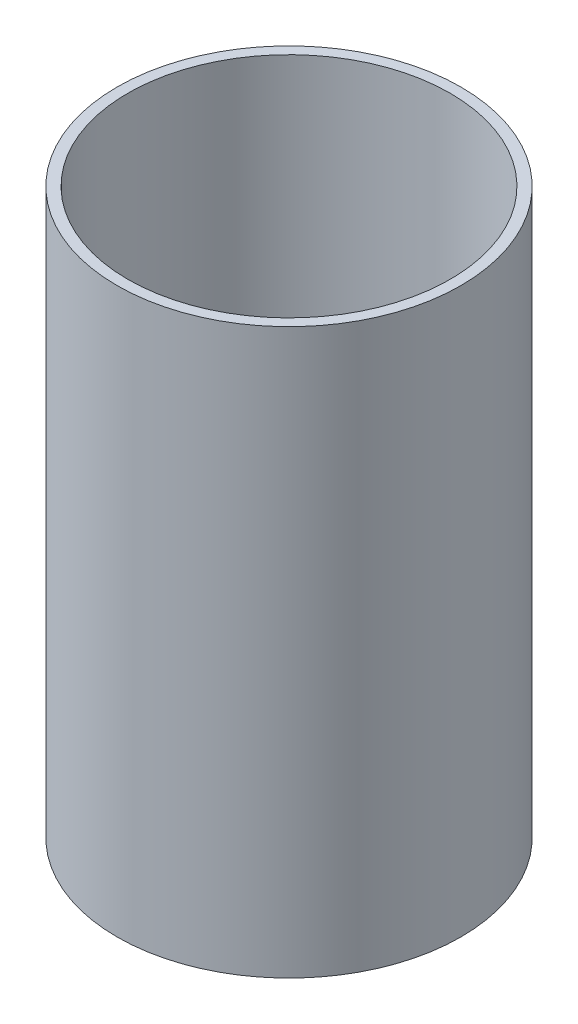
ISO-10303-21;
HEADER;
FILE_DESCRIPTION(('STEP AP214'),'2;1');
FILE_NAME('part.step','',(''),(''),'','','');
FILE_SCHEMA(('AUTOMOTIVE_DESIGN { 1 0 10303 214 1 1 1 1 }'));
ENDSEC;
DATA;
#1=APPLICATION_CONTEXT('core data for automotive mechanical design processes');
#2=APPLICATION_PROTOCOL_DEFINITION('international standard','automotive_design',2000,#1);
#3=PRODUCT_CONTEXT('',#1,'mechanical');
#4=PRODUCT('Part','Part','',(#3));
#5=PRODUCT_RELATED_PRODUCT_CATEGORY('part','',(#4));
#6=PRODUCT_DEFINITION_FORMATION('','',#4);
#7=PRODUCT_DEFINITION_CONTEXT('part definition',#1,'design');
#8=PRODUCT_DEFINITION('design','',#6,#7);
#9=PRODUCT_DEFINITION_SHAPE('','',#8);
#10=(LENGTH_UNIT() NAMED_UNIT(*) SI_UNIT(.MILLI.,.METRE.));
#11=(NAMED_UNIT(*) PLANE_ANGLE_UNIT() SI_UNIT($,.RADIAN.));
#12=(NAMED_UNIT(*) SI_UNIT($,.STERADIAN.) SOLID_ANGLE_UNIT());
#13=UNCERTAINTY_MEASURE_WITH_UNIT(LENGTH_MEASURE(1.E-05),#10,'distance_accuracy_value','');
#14=(GEOMETRIC_REPRESENTATION_CONTEXT(3) GLOBAL_UNCERTAINTY_ASSIGNED_CONTEXT((#13)) GLOBAL_UNIT_ASSIGNED_CONTEXT((#10,
#11,#12)) REPRESENTATION_CONTEXT('',''));
#15=CARTESIAN_POINT('',(0.,0.,0.));
#16=DIRECTION('',(0.,0.,1.));
#17=DIRECTION('',(1.,0.,0.));
#18=AXIS2_PLACEMENT_3D('',#15,#16,#17);
#19=CARTESIAN_POINT('',(0.,2.,0.));
#20=DIRECTION('',(0.,1.,0.));
#21=DIRECTION('',(0.,0.,1.));
#22=AXIS2_PLACEMENT_3D('',#19,#20,#21);
#23=PLANE('',#22);
#24=CARTESIAN_POINT('',(0.,2.,0.));
#25=DIRECTION('',(0.,1.,0.));
#26=DIRECTION('',(0.,0.,1.));
#27=AXIS2_PLACEMENT_3D('',#24,#25,#26);
#28=CIRCLE('',#27,0.6096);
#29=CARTESIAN_POINT('',(0.,2.,0.6096));
#30=VERTEX_POINT('',#29);
#31=EDGE_CURVE('E10',#30,#30,#28,.T.);
#32=ORIENTED_EDGE('',*,*,#31,.T.);
#33=EDGE_LOOP('',(#32));
#34=FACE_BOUND('',#33,.T.);
#35=CARTESIAN_POINT('',(0.,2.,0.));
#36=DIRECTION('',(0.,1.,0.));
#37=DIRECTION('',(0.,0.,1.));
#38=AXIS2_PLACEMENT_3D('',#35,#36,#37);
#39=CIRCLE('',#38,0.5715);
#40=CARTESIAN_POINT('',(0.,2.,0.5715));
#41=VERTEX_POINT('',#40);
#42=EDGE_CURVE('E43',#41,#41,#39,.T.);
#43=ORIENTED_EDGE('',*,*,#42,.F.);
#44=EDGE_LOOP('',(#43));
#45=FACE_BOUND('',#44,.T.);
#46=ADVANCED_FACE('F32',(#34,#45),#23,.T.);
#47=CARTESIAN_POINT('',(0.,0.,0.));
#48=DIRECTION('',(0.,1.,0.));
#49=DIRECTION('',(0.,0.,1.));
#50=AXIS2_PLACEMENT_3D('',#47,#48,#49);
#51=PLANE('',#50);
#52=CARTESIAN_POINT('',(0.,0.,0.));
#53=DIRECTION('',(0.,1.,0.));
#54=DIRECTION('',(0.,0.,1.));
#55=AXIS2_PLACEMENT_3D('',#52,#53,#54);
#56=CIRCLE('',#55,0.6096);
#57=CARTESIAN_POINT('',(0.,0.,0.6096));
#58=VERTEX_POINT('',#57);
#59=EDGE_CURVE('E36',#58,#58,#56,.T.);
#60=ORIENTED_EDGE('',*,*,#59,.F.);
#61=EDGE_LOOP('',(#60));
#62=FACE_BOUND('',#61,.T.);
#63=CARTESIAN_POINT('',(0.,0.,0.));
#64=DIRECTION('',(0.,1.,0.));
#65=DIRECTION('',(0.,0.,1.));
#66=AXIS2_PLACEMENT_3D('',#63,#64,#65);
#67=CIRCLE('',#66,0.5715);
#68=CARTESIAN_POINT('',(0.,0.,0.5715));
#69=VERTEX_POINT('',#68);
#70=EDGE_CURVE('E45',#69,#69,#67,.T.);
#71=ORIENTED_EDGE('',*,*,#70,.T.);
#72=EDGE_LOOP('',(#71));
#73=FACE_BOUND('',#72,.T.);
#74=ADVANCED_FACE('F55',(#62,#73),#51,.F.);
#75=CARTESIAN_POINT('',(0.,2.,0.));
#76=DIRECTION('',(0.,-1.,0.));
#77=DIRECTION('',(0.,0.,-1.));
#78=AXIS2_PLACEMENT_3D('',#75,#76,#77);
#79=CYLINDRICAL_SURFACE('',#78,0.6096);
#80=ORIENTED_EDGE('',*,*,#31,.F.);
#81=EDGE_LOOP('',(#80));
#82=FACE_BOUND('',#81,.T.);
#83=ORIENTED_EDGE('',*,*,#59,.T.);
#84=EDGE_LOOP('',(#83));
#85=FACE_BOUND('',#84,.T.);
#86=ADVANCED_FACE('F34',(#82,#85),#79,.T.);
#87=CARTESIAN_POINT('',(0.,2.,0.));
#88=DIRECTION('',(0.,-1.,0.));
#89=DIRECTION('',(0.,0.,-1.));
#90=AXIS2_PLACEMENT_3D('',#87,#88,#89);
#91=CYLINDRICAL_SURFACE('',#90,0.5715);
#92=ORIENTED_EDGE('',*,*,#42,.T.);
#93=EDGE_LOOP('',(#92));
#94=FACE_BOUND('',#93,.T.);
#95=ORIENTED_EDGE('',*,*,#70,.F.);
#96=EDGE_LOOP('',(#95));
#97=FACE_BOUND('',#96,.T.);
#98=ADVANCED_FACE('F51',(#94,#97),#91,.F.);
#99=CLOSED_SHELL('',(#46,#74,#86,#98));
#100=MANIFOLD_SOLID_BREP('B2',#99);
#101=ADVANCED_BREP_SHAPE_REPRESENTATION('',(#18,#100),#14);
#102=SHAPE_DEFINITION_REPRESENTATION(#9,#101);
ENDSEC;
END-ISO-10303-21;
